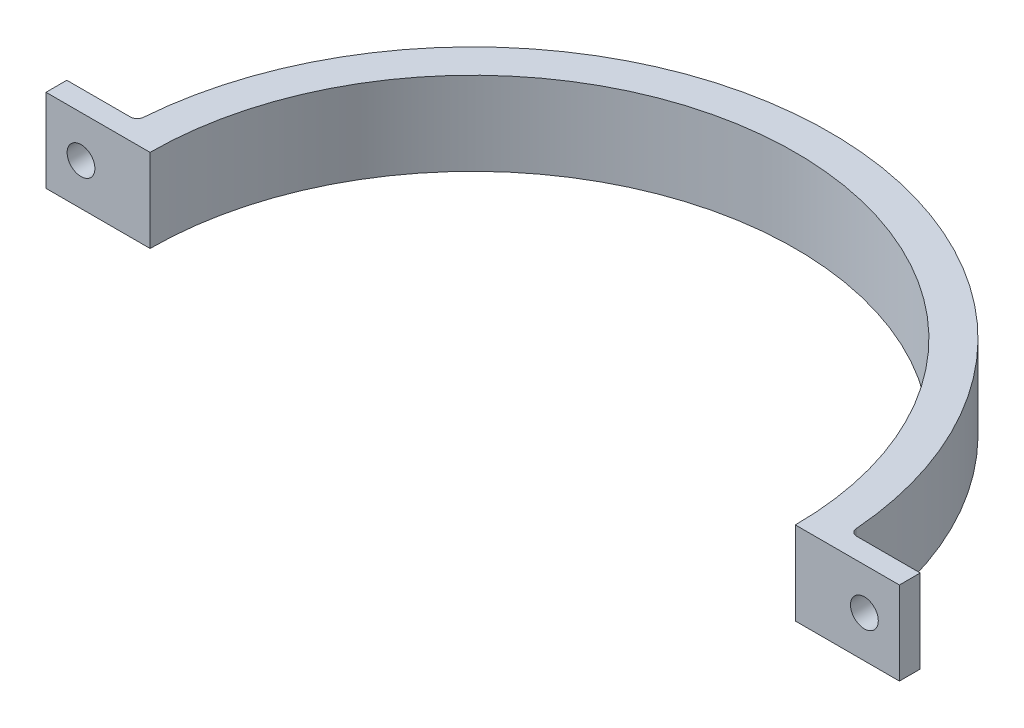
ISO-10303-21;
HEADER;
FILE_DESCRIPTION(('STEP AP214'),'2;1');
FILE_NAME('part.step','',(''),(''),'','','');
FILE_SCHEMA(('AUTOMOTIVE_DESIGN { 1 0 10303 214 1 1 1 1 }'));
ENDSEC;
DATA;
#1=APPLICATION_CONTEXT('core data for automotive mechanical design processes');
#2=APPLICATION_PROTOCOL_DEFINITION('international standard','automotive_design',2000,#1);
#3=PRODUCT_CONTEXT('',#1,'mechanical');
#4=PRODUCT('Part','Part','',(#3));
#5=PRODUCT_RELATED_PRODUCT_CATEGORY('part','',(#4));
#6=PRODUCT_DEFINITION_FORMATION('','',#4);
#7=PRODUCT_DEFINITION_CONTEXT('part definition',#1,'design');
#8=PRODUCT_DEFINITION('design','',#6,#7);
#9=PRODUCT_DEFINITION_SHAPE('','',#8);
#10=(LENGTH_UNIT() NAMED_UNIT(*) SI_UNIT(.MILLI.,.METRE.));
#11=(NAMED_UNIT(*) PLANE_ANGLE_UNIT() SI_UNIT($,.RADIAN.));
#12=(NAMED_UNIT(*) SI_UNIT($,.STERADIAN.) SOLID_ANGLE_UNIT());
#13=UNCERTAINTY_MEASURE_WITH_UNIT(LENGTH_MEASURE(1.E-05),#10,'distance_accuracy_value','');
#14=(GEOMETRIC_REPRESENTATION_CONTEXT(3) GLOBAL_UNCERTAINTY_ASSIGNED_CONTEXT((#13)) GLOBAL_UNIT_ASSIGNED_CONTEXT((#10,
#11,#12)) REPRESENTATION_CONTEXT('',''));
#15=CARTESIAN_POINT('',(0.,0.,0.));
#16=DIRECTION('',(0.,0.,1.));
#17=DIRECTION('',(1.,0.,0.));
#18=AXIS2_PLACEMENT_3D('',#15,#16,#17);
#19=CARTESIAN_POINT('',(0.,0.,0.));
#20=DIRECTION('',(0.,0.,1.));
#21=DIRECTION('',(1.,0.,0.));
#22=AXIS2_PLACEMENT_3D('',#19,#20,#21);
#23=PLANE('',#22);
#24=DIRECTION('',(1.,0.,0.));
#25=VECTOR('',#24,1.);
#26=CARTESIAN_POINT('',(0.,0.,0.));
#27=LINE('',#26,#25);
#28=CARTESIAN_POINT('',(46.5,0.,0.));
#29=VERTEX_POINT('',#28);
#30=CARTESIAN_POINT('',(61.5,0.,0.));
#31=VERTEX_POINT('',#30);
#32=EDGE_CURVE('E124',#29,#31,#27,.T.);
#33=ORIENTED_EDGE('',*,*,#32,.T.);
#34=DIRECTION('',(0.,1.,0.));
#35=VECTOR('',#34,1.);
#36=CARTESIAN_POINT('',(61.5,12.,0.));
#37=LINE('',#36,#35);
#38=CARTESIAN_POINT('',(61.5,12.,0.));
#39=VERTEX_POINT('',#38);
#40=EDGE_CURVE('E137',#31,#39,#37,.T.);
#41=ORIENTED_EDGE('',*,*,#40,.T.);
#42=DIRECTION('',(1.,0.,0.));
#43=VECTOR('',#42,1.);
#44=CARTESIAN_POINT('',(0.,12.,0.));
#45=LINE('',#44,#43);
#46=CARTESIAN_POINT('',(46.5,12.,0.));
#47=VERTEX_POINT('',#46);
#48=EDGE_CURVE('E218',#47,#39,#45,.T.);
#49=ORIENTED_EDGE('',*,*,#48,.F.);
#50=DIRECTION('',(0.,-1.,0.));
#51=VECTOR('',#50,1.);
#52=CARTESIAN_POINT('',(46.5,12.,0.));
#53=LINE('',#52,#51);
#54=EDGE_CURVE('E138',#29,#47,#53,.F.);
#55=ORIENTED_EDGE('',*,*,#54,.F.);
#56=EDGE_LOOP('',(#33,#41,#49,#55));
#57=FACE_BOUND('',#56,.T.);
#58=CARTESIAN_POINT('',(56.4562735533566,6.,0.));
#59=DIRECTION('',(0.,0.,1.));
#60=DIRECTION('',(1.,0.,0.));
#61=AXIS2_PLACEMENT_3D('',#58,#59,#60);
#62=CIRCLE('',#61,2.);
#63=CARTESIAN_POINT('',(58.4562735533566,6.,0.));
#64=VERTEX_POINT('',#63);
#65=EDGE_CURVE('E145',#64,#64,#62,.F.);
#66=ORIENTED_EDGE('',*,*,#65,.T.);
#67=EDGE_LOOP('',(#66));
#68=FACE_BOUND('',#67,.T.);
#69=ADVANCED_FACE('F44',(#57,#68),#23,.T.);
#70=CARTESIAN_POINT('',(-61.5,12.,0.));
#71=VERTEX_POINT('',#70);
#72=CARTESIAN_POINT('',(-46.5,12.,0.));
#73=VERTEX_POINT('',#72);
#74=EDGE_CURVE('E219',#71,#73,#45,.T.);
#75=ORIENTED_EDGE('',*,*,#74,.F.);
#76=DIRECTION('',(0.,-1.,0.));
#77=VECTOR('',#76,1.);
#78=CARTESIAN_POINT('',(-61.5,12.,0.));
#79=LINE('',#78,#77);
#80=CARTESIAN_POINT('',(-61.5,0.,0.));
#81=VERTEX_POINT('',#80);
#82=EDGE_CURVE('E140',#71,#81,#79,.T.);
#83=ORIENTED_EDGE('',*,*,#82,.T.);
#84=CARTESIAN_POINT('',(-46.5,0.,0.));
#85=VERTEX_POINT('',#84);
#86=EDGE_CURVE('E139',#81,#85,#27,.T.);
#87=ORIENTED_EDGE('',*,*,#86,.T.);
#88=DIRECTION('',(0.,-1.,0.));
#89=VECTOR('',#88,1.);
#90=CARTESIAN_POINT('',(-46.5,12.,0.));
#91=LINE('',#90,#89);
#92=EDGE_CURVE('E216',#73,#85,#91,.T.);
#93=ORIENTED_EDGE('',*,*,#92,.F.);
#94=EDGE_LOOP('',(#75,#83,#87,#93));
#95=FACE_BOUND('',#94,.T.);
#96=CARTESIAN_POINT('',(-56.4562735533566,6.,0.));
#97=DIRECTION('',(0.,0.,1.));
#98=DIRECTION('',(1.,0.,0.));
#99=AXIS2_PLACEMENT_3D('',#96,#97,#98);
#100=CIRCLE('',#99,2.);
#101=CARTESIAN_POINT('',(-54.4562735533566,6.,0.));
#102=VERTEX_POINT('',#101);
#103=EDGE_CURVE('E150',#102,#102,#100,.F.);
#104=ORIENTED_EDGE('',*,*,#103,.T.);
#105=EDGE_LOOP('',(#104));
#106=FACE_BOUND('',#105,.T.);
#107=ADVANCED_FACE('F225',(#95,#106),#23,.T.);
#108=CARTESIAN_POINT('',(0.,12.,0.));
#109=DIRECTION('',(0.,1.,0.));
#110=DIRECTION('',(0.,0.,1.));
#111=AXIS2_PLACEMENT_3D('',#108,#109,#110);
#112=PLANE('',#111);
#113=DIRECTION('',(0.,0.,1.));
#114=VECTOR('',#113,1.);
#115=CARTESIAN_POINT('',(-61.5,12.,3.00000000000004));
#116=LINE('',#115,#114);
#117=CARTESIAN_POINT('',(-61.5,12.,-3.));
#118=VERTEX_POINT('',#117);
#119=EDGE_CURVE('E156',#118,#71,#116,.T.);
#120=ORIENTED_EDGE('',*,*,#119,.T.);
#121=ORIENTED_EDGE('',*,*,#74,.T.);
#122=CARTESIAN_POINT('',(0.,12.,0.));
#123=DIRECTION('',(0.,1.,0.));
#124=DIRECTION('',(0.,0.,1.));
#125=AXIS2_PLACEMENT_3D('',#122,#123,#124);
#126=CIRCLE('',#125,46.5);
#127=EDGE_CURVE('E162',#47,#73,#126,.T.);
#128=ORIENTED_EDGE('',*,*,#127,.F.);
#129=ORIENTED_EDGE('',*,*,#48,.T.);
#130=DIRECTION('',(0.,0.,-1.));
#131=VECTOR('',#130,1.);
#132=CARTESIAN_POINT('',(61.5,12.,3.));
#133=LINE('',#132,#131);
#134=CARTESIAN_POINT('',(61.5,12.,-3.));
#135=VERTEX_POINT('',#134);
#136=EDGE_CURVE('E143',#39,#135,#133,.T.);
#137=ORIENTED_EDGE('',*,*,#136,.T.);
#138=DIRECTION('',(-1.,0.,0.));
#139=VECTOR('',#138,1.);
#140=CARTESIAN_POINT('',(61.5,12.,-3.));
#141=LINE('',#140,#139);
#142=CARTESIAN_POINT('',(52.3473972609909,12.,-3.));
#143=VERTEX_POINT('',#142);
#144=EDGE_CURVE('E157',#135,#143,#141,.T.);
#145=ORIENTED_EDGE('',*,*,#144,.T.);
#146=CARTESIAN_POINT('',(52.3473972609909,12.,-4.));
#147=DIRECTION('',(0.,1.,0.));
#148=DIRECTION('',(0.,0.,1.));
#149=AXIS2_PLACEMENT_3D('',#146,#147,#148);
#150=CIRCLE('',#149,1.);
#151=CARTESIAN_POINT('',(51.3503039798292,12.,-3.92380952380952));
#152=VERTEX_POINT('',#151);
#153=EDGE_CURVE('E13',#143,#152,#150,.F.);
#154=ORIENTED_EDGE('',*,*,#153,.T.);
#155=CARTESIAN_POINT('',(0.,12.,0.));
#156=DIRECTION('',(0.,1.,0.));
#157=DIRECTION('',(0.,0.,1.));
#158=AXIS2_PLACEMENT_3D('',#155,#156,#157);
#159=CIRCLE('',#158,51.5);
#160=CARTESIAN_POINT('',(-51.3503039798292,12.,-3.92380952380952));
#161=VERTEX_POINT('',#160);
#162=EDGE_CURVE('E189',#152,#161,#159,.T.);
#163=ORIENTED_EDGE('',*,*,#162,.T.);
#164=CARTESIAN_POINT('',(-52.3473972609909,12.,-4.));
#165=DIRECTION('',(0.,1.,0.));
#166=DIRECTION('',(0.,0.,1.));
#167=AXIS2_PLACEMENT_3D('',#164,#165,#166);
#168=CIRCLE('',#167,1.);
#169=CARTESIAN_POINT('',(-52.3473972609909,12.,-3.));
#170=VERTEX_POINT('',#169);
#171=EDGE_CURVE('E181',#161,#170,#168,.F.);
#172=ORIENTED_EDGE('',*,*,#171,.T.);
#173=DIRECTION('',(-1.,0.,0.));
#174=VECTOR('',#173,1.);
#175=CARTESIAN_POINT('',(-61.5,12.,-3.));
#176=LINE('',#175,#174);
#177=EDGE_CURVE('E158',#170,#118,#176,.T.);
#178=ORIENTED_EDGE('',*,*,#177,.T.);
#179=EDGE_LOOP('',(#120,#121,#128,#129,#137,#145,#154,#163,#172,#178));
#180=FACE_BOUND('',#179,.T.);
#181=ADVANCED_FACE('F186',(#180),#112,.T.);
#182=CARTESIAN_POINT('',(0.,0.,0.));
#183=DIRECTION('',(0.,1.,0.));
#184=DIRECTION('',(0.,0.,1.));
#185=AXIS2_PLACEMENT_3D('',#182,#183,#184);
#186=PLANE('',#185);
#187=ORIENTED_EDGE('',*,*,#86,.F.);
#188=DIRECTION('',(0.,0.,1.));
#189=VECTOR('',#188,1.);
#190=CARTESIAN_POINT('',(-61.5,0.,3.00000000000004));
#191=LINE('',#190,#189);
#192=CARTESIAN_POINT('',(-61.5,0.,-3.));
#193=VERTEX_POINT('',#192);
#194=EDGE_CURVE('E131',#193,#81,#191,.T.);
#195=ORIENTED_EDGE('',*,*,#194,.F.);
#196=DIRECTION('',(-1.,0.,0.));
#197=VECTOR('',#196,1.);
#198=CARTESIAN_POINT('',(-61.5,0.,-3.));
#199=LINE('',#198,#197);
#200=CARTESIAN_POINT('',(-52.3473972609909,0.,-3.));
#201=VERTEX_POINT('',#200);
#202=EDGE_CURVE('E161',#201,#193,#199,.T.);
#203=ORIENTED_EDGE('',*,*,#202,.F.);
#204=CARTESIAN_POINT('',(-52.3473972609909,0.,-4.));
#205=DIRECTION('',(0.,1.,0.));
#206=DIRECTION('',(0.,0.,1.));
#207=AXIS2_PLACEMENT_3D('',#204,#205,#206);
#208=CIRCLE('',#207,1.);
#209=CARTESIAN_POINT('',(-51.3503039798292,0.,-3.92380952380952));
#210=VERTEX_POINT('',#209);
#211=EDGE_CURVE('E179',#201,#210,#208,.T.);
#212=ORIENTED_EDGE('',*,*,#211,.T.);
#213=CARTESIAN_POINT('',(0.,0.,0.));
#214=DIRECTION('',(0.,1.,0.));
#215=DIRECTION('',(0.,0.,1.));
#216=AXIS2_PLACEMENT_3D('',#213,#214,#215);
#217=CIRCLE('',#216,51.5);
#218=CARTESIAN_POINT('',(51.3503039798292,0.,-3.92380952380952));
#219=VERTEX_POINT('',#218);
#220=EDGE_CURVE('E166',#219,#210,#217,.T.);
#221=ORIENTED_EDGE('',*,*,#220,.F.);
#222=CARTESIAN_POINT('',(52.3473972609909,0.,-4.));
#223=DIRECTION('',(0.,1.,0.));
#224=DIRECTION('',(0.,0.,1.));
#225=AXIS2_PLACEMENT_3D('',#222,#223,#224);
#226=CIRCLE('',#225,1.);
#227=CARTESIAN_POINT('',(52.3473972609909,0.,-3.));
#228=VERTEX_POINT('',#227);
#229=EDGE_CURVE('E52',#219,#228,#226,.T.);
#230=ORIENTED_EDGE('',*,*,#229,.T.);
#231=DIRECTION('',(-1.,0.,0.));
#232=VECTOR('',#231,1.);
#233=CARTESIAN_POINT('',(61.5,0.,-3.));
#234=LINE('',#233,#232);
#235=CARTESIAN_POINT('',(61.5,0.,-3.));
#236=VERTEX_POINT('',#235);
#237=EDGE_CURVE('E126',#236,#228,#234,.T.);
#238=ORIENTED_EDGE('',*,*,#237,.F.);
#239=DIRECTION('',(0.,0.,-1.));
#240=VECTOR('',#239,1.);
#241=CARTESIAN_POINT('',(61.5,0.,3.));
#242=LINE('',#241,#240);
#243=EDGE_CURVE('E119',#31,#236,#242,.T.);
#244=ORIENTED_EDGE('',*,*,#243,.F.);
#245=ORIENTED_EDGE('',*,*,#32,.F.);
#246=CARTESIAN_POINT('',(0.,0.,0.));
#247=DIRECTION('',(0.,1.,0.));
#248=DIRECTION('',(0.,0.,1.));
#249=AXIS2_PLACEMENT_3D('',#246,#247,#248);
#250=CIRCLE('',#249,46.5);
#251=EDGE_CURVE('E165',#29,#85,#250,.T.);
#252=ORIENTED_EDGE('',*,*,#251,.T.);
#253=EDGE_LOOP('',(#187,#195,#203,#212,#221,#230,#238,#244,#245,#252));
#254=FACE_BOUND('',#253,.T.);
#255=ADVANCED_FACE('F122',(#254),#186,.F.);
#256=CARTESIAN_POINT('',(-61.5,12.,3.00000000000004));
#257=DIRECTION('',(1.,0.,0.));
#258=DIRECTION('',(0.,0.,-1.));
#259=AXIS2_PLACEMENT_3D('',#256,#257,#258);
#260=PLANE('',#259);
#261=ORIENTED_EDGE('',*,*,#82,.F.);
#262=ORIENTED_EDGE('',*,*,#119,.F.);
#263=DIRECTION('',(0.,-1.,0.));
#264=VECTOR('',#263,1.);
#265=CARTESIAN_POINT('',(-61.5,12.,-3.));
#266=LINE('',#265,#264);
#267=EDGE_CURVE('E197',#118,#193,#266,.T.);
#268=ORIENTED_EDGE('',*,*,#267,.T.);
#269=ORIENTED_EDGE('',*,*,#194,.T.);
#270=EDGE_LOOP('',(#261,#262,#268,#269));
#271=FACE_BOUND('',#270,.T.);
#272=ADVANCED_FACE('F250',(#271),#260,.F.);
#273=CARTESIAN_POINT('',(61.5,12.,3.));
#274=DIRECTION('',(-1.,0.,0.));
#275=DIRECTION('',(0.,0.,1.));
#276=AXIS2_PLACEMENT_3D('',#273,#274,#275);
#277=PLANE('',#276);
#278=ORIENTED_EDGE('',*,*,#40,.F.);
#279=ORIENTED_EDGE('',*,*,#243,.T.);
#280=DIRECTION('',(0.,-1.,0.));
#281=VECTOR('',#280,1.);
#282=CARTESIAN_POINT('',(61.5,12.,-3.));
#283=LINE('',#282,#281);
#284=EDGE_CURVE('E210',#135,#236,#283,.T.);
#285=ORIENTED_EDGE('',*,*,#284,.F.);
#286=ORIENTED_EDGE('',*,*,#136,.F.);
#287=EDGE_LOOP('',(#278,#279,#285,#286));
#288=FACE_BOUND('',#287,.T.);
#289=ADVANCED_FACE('F142',(#288),#277,.F.);
#290=CARTESIAN_POINT('',(0.,12.,0.));
#291=DIRECTION('',(0.,-1.,0.));
#292=DIRECTION('',(0.,0.,-1.));
#293=AXIS2_PLACEMENT_3D('',#290,#291,#292);
#294=CYLINDRICAL_SURFACE('',#293,46.5);
#295=ORIENTED_EDGE('',*,*,#127,.T.);
#296=ORIENTED_EDGE('',*,*,#92,.T.);
#297=ORIENTED_EDGE('',*,*,#251,.F.);
#298=ORIENTED_EDGE('',*,*,#54,.T.);
#299=EDGE_LOOP('',(#295,#296,#297,#298));
#300=FACE_BOUND('',#299,.T.);
#301=ADVANCED_FACE('F229',(#300),#294,.F.);
#302=CARTESIAN_POINT('',(56.4562735533566,6.,-9.));
#303=DIRECTION('',(0.,0.,1.));
#304=DIRECTION('',(1.,0.,0.));
#305=AXIS2_PLACEMENT_3D('',#302,#303,#304);
#306=CYLINDRICAL_SURFACE('',#305,2.);
#307=CARTESIAN_POINT('',(56.4562735533566,6.,-3.));
#308=DIRECTION('',(0.,0.,1.));
#309=DIRECTION('',(1.,0.,0.));
#310=AXIS2_PLACEMENT_3D('',#307,#308,#309);
#311=CIRCLE('',#310,2.);
#312=CARTESIAN_POINT('',(58.4562735533566,6.,-3.));
#313=VERTEX_POINT('',#312);
#314=EDGE_CURVE('E173',#313,#313,#311,.T.);
#315=ORIENTED_EDGE('',*,*,#314,.F.);
#316=EDGE_LOOP('',(#315));
#317=FACE_BOUND('',#316,.T.);
#318=ORIENTED_EDGE('',*,*,#65,.F.);
#319=EDGE_LOOP('',(#318));
#320=FACE_BOUND('',#319,.T.);
#321=ADVANCED_FACE('F256',(#317,#320),#306,.F.);
#322=CARTESIAN_POINT('',(-56.4562735533566,6.,-9.));
#323=DIRECTION('',(0.,0.,1.));
#324=DIRECTION('',(1.,0.,0.));
#325=AXIS2_PLACEMENT_3D('',#322,#323,#324);
#326=CYLINDRICAL_SURFACE('',#325,2.);
#327=CARTESIAN_POINT('',(-56.4562735533566,6.,-3.));
#328=DIRECTION('',(0.,0.,1.));
#329=DIRECTION('',(1.,0.,0.));
#330=AXIS2_PLACEMENT_3D('',#327,#328,#329);
#331=CIRCLE('',#330,2.);
#332=CARTESIAN_POINT('',(-54.4562735533566,6.,-3.));
#333=VERTEX_POINT('',#332);
#334=EDGE_CURVE('E168',#333,#333,#331,.T.);
#335=ORIENTED_EDGE('',*,*,#334,.F.);
#336=EDGE_LOOP('',(#335));
#337=FACE_BOUND('',#336,.T.);
#338=ORIENTED_EDGE('',*,*,#103,.F.);
#339=EDGE_LOOP('',(#338));
#340=FACE_BOUND('',#339,.T.);
#341=ADVANCED_FACE('F269',(#337,#340),#326,.F.);
#342=CARTESIAN_POINT('',(0.,12.,0.));
#343=DIRECTION('',(0.,-1.,0.));
#344=DIRECTION('',(0.,0.,-1.));
#345=AXIS2_PLACEMENT_3D('',#342,#343,#344);
#346=CYLINDRICAL_SURFACE('',#345,51.5);
#347=ORIENTED_EDGE('',*,*,#220,.T.);
#348=DIRECTION('',(0.,-1.,0.));
#349=VECTOR('',#348,1.);
#350=CARTESIAN_POINT('',(-51.3503039798292,12.,-3.92380952380952));
#351=LINE('',#350,#349);
#352=EDGE_CURVE('E176',#210,#161,#351,.F.);
#353=ORIENTED_EDGE('',*,*,#352,.T.);
#354=ORIENTED_EDGE('',*,*,#162,.F.);
#355=DIRECTION('',(0.,-1.,0.));
#356=VECTOR('',#355,1.);
#357=CARTESIAN_POINT('',(51.3503039798292,12.,-3.92380952380952));
#358=LINE('',#357,#356);
#359=EDGE_CURVE('E172',#152,#219,#358,.T.);
#360=ORIENTED_EDGE('',*,*,#359,.T.);
#361=EDGE_LOOP('',(#347,#353,#354,#360));
#362=FACE_BOUND('',#361,.T.);
#363=ADVANCED_FACE('F204',(#362),#346,.T.);
#364=CARTESIAN_POINT('',(-61.5,12.,-3.));
#365=DIRECTION('',(0.,0.,1.));
#366=DIRECTION('',(1.,0.,0.));
#367=AXIS2_PLACEMENT_3D('',#364,#365,#366);
#368=PLANE('',#367);
#369=ORIENTED_EDGE('',*,*,#334,.T.);
#370=EDGE_LOOP('',(#369));
#371=FACE_BOUND('',#370,.T.);
#372=ORIENTED_EDGE('',*,*,#177,.F.);
#373=DIRECTION('',(0.,1.,0.));
#374=VECTOR('',#373,1.);
#375=CARTESIAN_POINT('',(-52.3473972609909,0.,-3.));
#376=LINE('',#375,#374);
#377=EDGE_CURVE('E169',#170,#201,#376,.F.);
#378=ORIENTED_EDGE('',*,*,#377,.T.);
#379=ORIENTED_EDGE('',*,*,#202,.T.);
#380=ORIENTED_EDGE('',*,*,#267,.F.);
#381=EDGE_LOOP('',(#372,#378,#379,#380));
#382=FACE_BOUND('',#381,.T.);
#383=ADVANCED_FACE('F194',(#371,#382),#368,.F.);
#384=CARTESIAN_POINT('',(61.5,12.,-3.));
#385=DIRECTION('',(0.,0.,1.));
#386=DIRECTION('',(1.,0.,0.));
#387=AXIS2_PLACEMENT_3D('',#384,#385,#386);
#388=PLANE('',#387);
#389=ORIENTED_EDGE('',*,*,#314,.T.);
#390=EDGE_LOOP('',(#389));
#391=FACE_BOUND('',#390,.T.);
#392=ORIENTED_EDGE('',*,*,#237,.T.);
#393=DIRECTION('',(0.,1.,0.));
#394=VECTOR('',#393,1.);
#395=CARTESIAN_POINT('',(52.3473972609909,12.,-3.));
#396=LINE('',#395,#394);
#397=EDGE_CURVE('E59',#228,#143,#396,.T.);
#398=ORIENTED_EDGE('',*,*,#397,.T.);
#399=ORIENTED_EDGE('',*,*,#144,.F.);
#400=ORIENTED_EDGE('',*,*,#284,.T.);
#401=EDGE_LOOP('',(#392,#398,#399,#400));
#402=FACE_BOUND('',#401,.T.);
#403=ADVANCED_FACE('F232',(#391,#402),#388,.F.);
#404=CARTESIAN_POINT('',(-52.3473972609909,12.,-4.));
#405=DIRECTION('',(0.,-1.,0.));
#406=DIRECTION('',(0.,0.,-1.));
#407=AXIS2_PLACEMENT_3D('',#404,#405,#406);
#408=CYLINDRICAL_SURFACE('',#407,1.);
#409=ORIENTED_EDGE('',*,*,#171,.F.);
#410=ORIENTED_EDGE('',*,*,#352,.F.);
#411=ORIENTED_EDGE('',*,*,#211,.F.);
#412=ORIENTED_EDGE('',*,*,#377,.F.);
#413=EDGE_LOOP('',(#409,#410,#411,#412));
#414=FACE_BOUND('',#413,.T.);
#415=ADVANCED_FACE('F200',(#414),#408,.F.);
#416=CARTESIAN_POINT('',(52.3473972609909,12.,-4.));
#417=DIRECTION('',(0.,-1.,0.));
#418=DIRECTION('',(0.,0.,-1.));
#419=AXIS2_PLACEMENT_3D('',#416,#417,#418);
#420=CYLINDRICAL_SURFACE('',#419,1.);
#421=ORIENTED_EDGE('',*,*,#153,.F.);
#422=ORIENTED_EDGE('',*,*,#397,.F.);
#423=ORIENTED_EDGE('',*,*,#229,.F.);
#424=ORIENTED_EDGE('',*,*,#359,.F.);
#425=EDGE_LOOP('',(#421,#422,#423,#424));
#426=FACE_BOUND('',#425,.T.);
#427=ADVANCED_FACE('F46',(#426),#420,.F.);
#428=CLOSED_SHELL('',(#69,#107,#181,#255,#272,#289,#301,#321,#341,#363,#383,#403,#415,#427));
#429=MANIFOLD_SOLID_BREP('B2',#428);
#430=ADVANCED_BREP_SHAPE_REPRESENTATION('',(#18,#429),#14);
#431=SHAPE_DEFINITION_REPRESENTATION(#9,#430);
ENDSEC;
END-ISO-10303-21;
